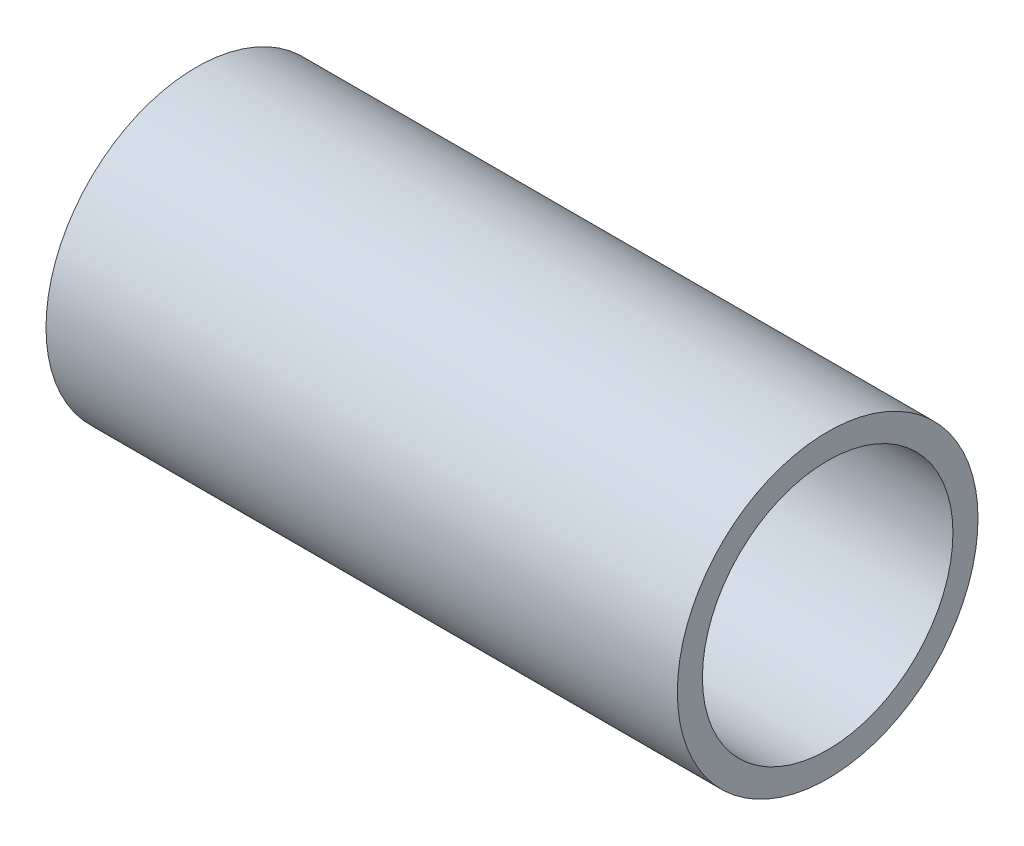
ISO-10303-21;
HEADER;
FILE_DESCRIPTION(('STEP AP214'),'2;1');
FILE_NAME('part.step','',(''),(''),'','','');
FILE_SCHEMA(('AUTOMOTIVE_DESIGN { 1 0 10303 214 1 1 1 1 }'));
ENDSEC;
DATA;
#1=APPLICATION_CONTEXT('core data for automotive mechanical design processes');
#2=APPLICATION_PROTOCOL_DEFINITION('international standard','automotive_design',2000,#1);
#3=PRODUCT_CONTEXT('',#1,'mechanical');
#4=PRODUCT('Part','Part','',(#3));
#5=PRODUCT_RELATED_PRODUCT_CATEGORY('part','',(#4));
#6=PRODUCT_DEFINITION_FORMATION('','',#4);
#7=PRODUCT_DEFINITION_CONTEXT('part definition',#1,'design');
#8=PRODUCT_DEFINITION('design','',#6,#7);
#9=PRODUCT_DEFINITION_SHAPE('','',#8);
#10=(LENGTH_UNIT() NAMED_UNIT(*) SI_UNIT(.MILLI.,.METRE.));
#11=(NAMED_UNIT(*) PLANE_ANGLE_UNIT() SI_UNIT($,.RADIAN.));
#12=(NAMED_UNIT(*) SI_UNIT($,.STERADIAN.) SOLID_ANGLE_UNIT());
#13=UNCERTAINTY_MEASURE_WITH_UNIT(LENGTH_MEASURE(1.E-05),#10,'distance_accuracy_value','');
#14=(GEOMETRIC_REPRESENTATION_CONTEXT(3) GLOBAL_UNCERTAINTY_ASSIGNED_CONTEXT((#13)) GLOBAL_UNIT_ASSIGNED_CONTEXT((#10,
#11,#12)) REPRESENTATION_CONTEXT('',''));
#15=CARTESIAN_POINT('',(0.,0.,0.));
#16=DIRECTION('',(0.,0.,1.));
#17=DIRECTION('',(1.,0.,0.));
#18=AXIS2_PLACEMENT_3D('',#15,#16,#17);
#19=CARTESIAN_POINT('',(63.,0.,0.));
#20=DIRECTION('',(1.,0.,0.));
#21=DIRECTION('',(0.,0.,-1.));
#22=AXIS2_PLACEMENT_3D('',#19,#20,#21);
#23=PLANE('',#22);
#24=CARTESIAN_POINT('',(63.,0.,0.));
#25=DIRECTION('',(1.,0.,0.));
#26=DIRECTION('',(0.,0.,-1.));
#27=AXIS2_PLACEMENT_3D('',#24,#25,#26);
#28=CIRCLE('',#27,15.);
#29=CARTESIAN_POINT('',(63.,0.,-15.));
#30=VERTEX_POINT('',#29);
#31=EDGE_CURVE('E10',#30,#30,#28,.T.);
#32=ORIENTED_EDGE('',*,*,#31,.T.);
#33=EDGE_LOOP('',(#32));
#34=FACE_BOUND('',#33,.T.);
#35=CARTESIAN_POINT('',(63.,0.,0.));
#36=DIRECTION('',(1.,0.,0.));
#37=DIRECTION('',(0.,0.,-1.));
#38=AXIS2_PLACEMENT_3D('',#35,#36,#37);
#39=CIRCLE('',#38,12.5);
#40=CARTESIAN_POINT('',(63.,0.,-12.5));
#41=VERTEX_POINT('',#40);
#42=EDGE_CURVE('E56',#41,#41,#39,.T.);
#43=ORIENTED_EDGE('',*,*,#42,.F.);
#44=EDGE_LOOP('',(#43));
#45=FACE_BOUND('',#44,.T.);
#46=ADVANCED_FACE('F41',(#34,#45),#23,.T.);
#47=CARTESIAN_POINT('',(0.,0.,0.));
#48=DIRECTION('',(1.,0.,0.));
#49=DIRECTION('',(0.,0.,-1.));
#50=AXIS2_PLACEMENT_3D('',#47,#48,#49);
#51=PLANE('',#50);
#52=CARTESIAN_POINT('',(0.,0.,0.));
#53=DIRECTION('',(1.,0.,0.));
#54=DIRECTION('',(0.,0.,-1.));
#55=AXIS2_PLACEMENT_3D('',#52,#53,#54);
#56=CIRCLE('',#55,15.);
#57=CARTESIAN_POINT('',(0.,0.,-15.));
#58=VERTEX_POINT('',#57);
#59=EDGE_CURVE('E45',#58,#58,#56,.T.);
#60=ORIENTED_EDGE('',*,*,#59,.F.);
#61=EDGE_LOOP('',(#60));
#62=FACE_BOUND('',#61,.T.);
#63=CARTESIAN_POINT('',(0.,0.,0.));
#64=DIRECTION('',(1.,0.,0.));
#65=DIRECTION('',(0.,0.,-1.));
#66=AXIS2_PLACEMENT_3D('',#63,#64,#65);
#67=CIRCLE('',#66,12.5);
#68=CARTESIAN_POINT('',(0.,0.,-12.5));
#69=VERTEX_POINT('',#68);
#70=EDGE_CURVE('E58',#69,#69,#67,.T.);
#71=ORIENTED_EDGE('',*,*,#70,.T.);
#72=EDGE_LOOP('',(#71));
#73=FACE_BOUND('',#72,.T.);
#74=ADVANCED_FACE('F72',(#62,#73),#51,.F.);
#75=CARTESIAN_POINT('',(63.,0.,0.));
#76=DIRECTION('',(-1.,0.,0.));
#77=DIRECTION('',(0.,0.,1.));
#78=AXIS2_PLACEMENT_3D('',#75,#76,#77);
#79=CYLINDRICAL_SURFACE('',#78,15.);
#80=ORIENTED_EDGE('',*,*,#31,.F.);
#81=EDGE_LOOP('',(#80));
#82=FACE_BOUND('',#81,.T.);
#83=ORIENTED_EDGE('',*,*,#59,.T.);
#84=EDGE_LOOP('',(#83));
#85=FACE_BOUND('',#84,.T.);
#86=ADVANCED_FACE('F43',(#82,#85),#79,.T.);
#87=CARTESIAN_POINT('',(63.,0.,0.));
#88=DIRECTION('',(-1.,0.,0.));
#89=DIRECTION('',(0.,0.,1.));
#90=AXIS2_PLACEMENT_3D('',#87,#88,#89);
#91=CYLINDRICAL_SURFACE('',#90,12.5);
#92=ORIENTED_EDGE('',*,*,#42,.T.);
#93=EDGE_LOOP('',(#92));
#94=FACE_BOUND('',#93,.T.);
#95=ORIENTED_EDGE('',*,*,#70,.F.);
#96=EDGE_LOOP('',(#95));
#97=FACE_BOUND('',#96,.T.);
#98=ADVANCED_FACE('F68',(#94,#97),#91,.F.);
#99=CLOSED_SHELL('',(#46,#74,#86,#98));
#100=MANIFOLD_SOLID_BREP('B2',#99);
#101=ADVANCED_BREP_SHAPE_REPRESENTATION('',(#18,#100),#14);
#102=SHAPE_DEFINITION_REPRESENTATION(#9,#101);
ENDSEC;
END-ISO-10303-21;
